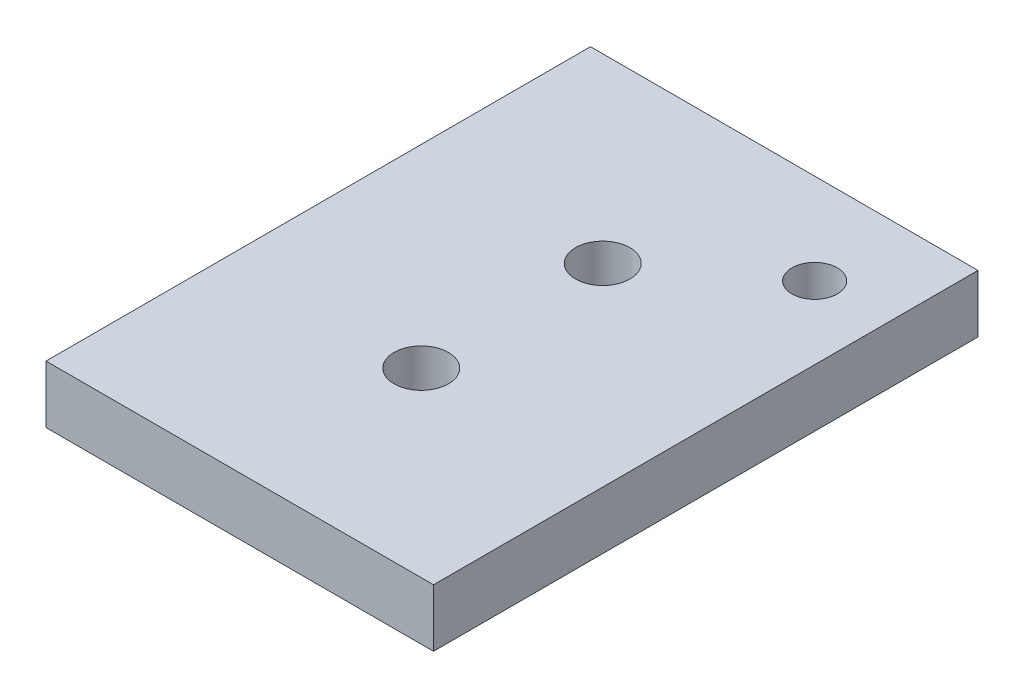
ISO-10303-21;
HEADER;
FILE_DESCRIPTION(('STEP AP214'),'2;1');
FILE_NAME('part.step','',(''),(''),'','','');
FILE_SCHEMA(('AUTOMOTIVE_DESIGN { 1 0 10303 214 1 1 1 1 }'));
ENDSEC;
DATA;
#1=APPLICATION_CONTEXT('core data for automotive mechanical design processes');
#2=APPLICATION_PROTOCOL_DEFINITION('international standard','automotive_design',2000,#1);
#3=PRODUCT_CONTEXT('',#1,'mechanical');
#4=PRODUCT('Part','Part','',(#3));
#5=PRODUCT_RELATED_PRODUCT_CATEGORY('part','',(#4));
#6=PRODUCT_DEFINITION_FORMATION('','',#4);
#7=PRODUCT_DEFINITION_CONTEXT('part definition',#1,'design');
#8=PRODUCT_DEFINITION('design','',#6,#7);
#9=PRODUCT_DEFINITION_SHAPE('','',#8);
#10=(LENGTH_UNIT() NAMED_UNIT(*) SI_UNIT(.MILLI.,.METRE.));
#11=(NAMED_UNIT(*) PLANE_ANGLE_UNIT() SI_UNIT($,.RADIAN.));
#12=(NAMED_UNIT(*) SI_UNIT($,.STERADIAN.) SOLID_ANGLE_UNIT());
#13=UNCERTAINTY_MEASURE_WITH_UNIT(LENGTH_MEASURE(1.E-05),#10,'distance_accuracy_value','');
#14=(GEOMETRIC_REPRESENTATION_CONTEXT(3) GLOBAL_UNCERTAINTY_ASSIGNED_CONTEXT((#13)) GLOBAL_UNIT_ASSIGNED_CONTEXT((#10,
#11,#12)) REPRESENTATION_CONTEXT('',''));
#15=CARTESIAN_POINT('',(0.,0.,0.));
#16=DIRECTION('',(0.,0.,1.));
#17=DIRECTION('',(1.,0.,0.));
#18=AXIS2_PLACEMENT_3D('',#15,#16,#17);
#19=CARTESIAN_POINT('',(0.,3.175,0.));
#20=DIRECTION('',(-1.,0.,0.));
#21=DIRECTION('',(0.,0.,1.));
#22=AXIS2_PLACEMENT_3D('',#19,#20,#21);
#23=PLANE('',#22);
#24=DIRECTION('',(0.,0.,-1.));
#25=VECTOR('',#24,1.);
#26=CARTESIAN_POINT('',(0.,0.,0.));
#27=LINE('',#26,#25);
#28=CARTESIAN_POINT('',(0.,0.,0.));
#29=VERTEX_POINT('',#28);
#30=CARTESIAN_POINT('',(0.,0.,-30.));
#31=VERTEX_POINT('',#30);
#32=EDGE_CURVE('E106',#29,#31,#27,.T.);
#33=ORIENTED_EDGE('',*,*,#32,.F.);
#34=DIRECTION('',(0.,-1.,0.));
#35=VECTOR('',#34,1.);
#36=CARTESIAN_POINT('',(0.,3.175,0.));
#37=LINE('',#36,#35);
#38=CARTESIAN_POINT('',(0.,3.175,0.));
#39=VERTEX_POINT('',#38);
#40=EDGE_CURVE('E11',#39,#29,#37,.T.);
#41=ORIENTED_EDGE('',*,*,#40,.F.);
#42=DIRECTION('',(0.,0.,-1.));
#43=VECTOR('',#42,1.);
#44=CARTESIAN_POINT('',(0.,3.175,0.));
#45=LINE('',#44,#43);
#46=CARTESIAN_POINT('',(0.,3.175,-30.));
#47=VERTEX_POINT('',#46);
#48=EDGE_CURVE('E90',#39,#47,#45,.T.);
#49=ORIENTED_EDGE('',*,*,#48,.T.);
#50=DIRECTION('',(0.,-1.,0.));
#51=VECTOR('',#50,1.);
#52=CARTESIAN_POINT('',(0.,3.175,-30.));
#53=LINE('',#52,#51);
#54=EDGE_CURVE('E52',#47,#31,#53,.T.);
#55=ORIENTED_EDGE('',*,*,#54,.T.);
#56=EDGE_LOOP('',(#33,#41,#49,#55));
#57=FACE_BOUND('',#56,.T.);
#58=ADVANCED_FACE('F35',(#57),#23,.T.);
#59=CARTESIAN_POINT('',(0.,3.175,0.));
#60=DIRECTION('',(0.,0.,-1.));
#61=DIRECTION('',(-1.,0.,0.));
#62=AXIS2_PLACEMENT_3D('',#59,#60,#61);
#63=PLANE('',#62);
#64=DIRECTION('',(1.,0.,0.));
#65=VECTOR('',#64,1.);
#66=CARTESIAN_POINT('',(0.,0.,0.));
#67=LINE('',#66,#65);
#68=CARTESIAN_POINT('',(21.35,0.,0.));
#69=VERTEX_POINT('',#68);
#70=EDGE_CURVE('E95',#29,#69,#67,.T.);
#71=ORIENTED_EDGE('',*,*,#70,.T.);
#72=DIRECTION('',(0.,-1.,0.));
#73=VECTOR('',#72,1.);
#74=CARTESIAN_POINT('',(21.35,3.175,0.));
#75=LINE('',#74,#73);
#76=CARTESIAN_POINT('',(21.35,3.175,0.));
#77=VERTEX_POINT('',#76);
#78=EDGE_CURVE('E44',#77,#69,#75,.T.);
#79=ORIENTED_EDGE('',*,*,#78,.F.);
#80=DIRECTION('',(1.,0.,0.));
#81=VECTOR('',#80,1.);
#82=CARTESIAN_POINT('',(0.,3.175,0.));
#83=LINE('',#82,#81);
#84=EDGE_CURVE('E86',#39,#77,#83,.T.);
#85=ORIENTED_EDGE('',*,*,#84,.F.);
#86=ORIENTED_EDGE('',*,*,#40,.T.);
#87=EDGE_LOOP('',(#71,#79,#85,#86));
#88=FACE_BOUND('',#87,.T.);
#89=ADVANCED_FACE('F93',(#88),#63,.F.);
#90=CARTESIAN_POINT('',(21.35,3.175,0.));
#91=DIRECTION('',(-1.,0.,0.));
#92=DIRECTION('',(0.,0.,1.));
#93=AXIS2_PLACEMENT_3D('',#90,#91,#92);
#94=PLANE('',#93);
#95=DIRECTION('',(0.,0.,-1.));
#96=VECTOR('',#95,1.);
#97=CARTESIAN_POINT('',(21.35,0.,0.));
#98=LINE('',#97,#96);
#99=CARTESIAN_POINT('',(21.35,0.,-30.));
#100=VERTEX_POINT('',#99);
#101=EDGE_CURVE('E103',#69,#100,#98,.T.);
#102=ORIENTED_EDGE('',*,*,#101,.T.);
#103=DIRECTION('',(0.,-1.,0.));
#104=VECTOR('',#103,1.);
#105=CARTESIAN_POINT('',(21.35,3.175,-30.));
#106=LINE('',#105,#104);
#107=CARTESIAN_POINT('',(21.35,3.175,-30.));
#108=VERTEX_POINT('',#107);
#109=EDGE_CURVE('E66',#108,#100,#106,.T.);
#110=ORIENTED_EDGE('',*,*,#109,.F.);
#111=DIRECTION('',(0.,0.,-1.));
#112=VECTOR('',#111,1.);
#113=CARTESIAN_POINT('',(21.35,3.175,0.));
#114=LINE('',#113,#112);
#115=EDGE_CURVE('E78',#77,#108,#114,.T.);
#116=ORIENTED_EDGE('',*,*,#115,.F.);
#117=ORIENTED_EDGE('',*,*,#78,.T.);
#118=EDGE_LOOP('',(#102,#110,#116,#117));
#119=FACE_BOUND('',#118,.T.);
#120=ADVANCED_FACE('F80',(#119),#94,.F.);
#121=CARTESIAN_POINT('',(17.35,3.175,-25.));
#122=DIRECTION('',(0.,-1.,0.));
#123=DIRECTION('',(0.,0.,-1.));
#124=AXIS2_PLACEMENT_3D('',#121,#122,#123);
#125=CYLINDRICAL_SURFACE('',#124,1.25000000000002);
#126=CARTESIAN_POINT('',(17.35,3.175,-25.));
#127=DIRECTION('',(0.,1.,0.));
#128=DIRECTION('',(0.,0.,1.));
#129=AXIS2_PLACEMENT_3D('',#126,#127,#128);
#130=CIRCLE('',#129,1.25000000000002);
#131=CARTESIAN_POINT('',(17.35,3.175,-23.75));
#132=VERTEX_POINT('',#131);
#133=EDGE_CURVE('E119',#132,#132,#130,.T.);
#134=ORIENTED_EDGE('',*,*,#133,.T.);
#135=EDGE_LOOP('',(#134));
#136=FACE_BOUND('',#135,.T.);
#137=CARTESIAN_POINT('',(17.35,0.,-25.));
#138=DIRECTION('',(0.,1.,0.));
#139=DIRECTION('',(0.,0.,1.));
#140=AXIS2_PLACEMENT_3D('',#137,#138,#139);
#141=CIRCLE('',#140,1.25000000000002);
#142=CARTESIAN_POINT('',(17.35,0.,-23.75));
#143=VERTEX_POINT('',#142);
#144=EDGE_CURVE('E108',#143,#143,#141,.T.);
#145=ORIENTED_EDGE('',*,*,#144,.F.);
#146=EDGE_LOOP('',(#145));
#147=FACE_BOUND('',#146,.T.);
#148=ADVANCED_FACE('F139',(#136,#147),#125,.F.);
#149=CARTESIAN_POINT('',(10.675,3.175,-10.));
#150=DIRECTION('',(0.,-1.,0.));
#151=DIRECTION('',(0.,0.,-1.));
#152=AXIS2_PLACEMENT_3D('',#149,#150,#151);
#153=CYLINDRICAL_SURFACE('',#152,1.5);
#154=CARTESIAN_POINT('',(10.675,3.175,-10.));
#155=DIRECTION('',(0.,1.,0.));
#156=DIRECTION('',(0.,0.,1.));
#157=AXIS2_PLACEMENT_3D('',#154,#155,#156);
#158=CIRCLE('',#157,1.5);
#159=CARTESIAN_POINT('',(10.675,3.175,-8.5));
#160=VERTEX_POINT('',#159);
#161=EDGE_CURVE('E122',#160,#160,#158,.T.);
#162=ORIENTED_EDGE('',*,*,#161,.T.);
#163=EDGE_LOOP('',(#162));
#164=FACE_BOUND('',#163,.T.);
#165=CARTESIAN_POINT('',(10.675,0.,-10.));
#166=DIRECTION('',(0.,1.,0.));
#167=DIRECTION('',(0.,0.,1.));
#168=AXIS2_PLACEMENT_3D('',#165,#166,#167);
#169=CIRCLE('',#168,1.5);
#170=CARTESIAN_POINT('',(10.675,0.,-8.5));
#171=VERTEX_POINT('',#170);
#172=EDGE_CURVE('E111',#171,#171,#169,.T.);
#173=ORIENTED_EDGE('',*,*,#172,.F.);
#174=EDGE_LOOP('',(#173));
#175=FACE_BOUND('',#174,.T.);
#176=ADVANCED_FACE('F142',(#164,#175),#153,.F.);
#177=CARTESIAN_POINT('',(10.675,3.175,-20.));
#178=DIRECTION('',(0.,-1.,0.));
#179=DIRECTION('',(0.,0.,-1.));
#180=AXIS2_PLACEMENT_3D('',#177,#178,#179);
#181=CYLINDRICAL_SURFACE('',#180,1.5);
#182=CARTESIAN_POINT('',(10.675,3.175,-20.));
#183=DIRECTION('',(0.,1.,0.));
#184=DIRECTION('',(0.,0.,1.));
#185=AXIS2_PLACEMENT_3D('',#182,#183,#184);
#186=CIRCLE('',#185,1.5);
#187=CARTESIAN_POINT('',(10.675,3.175,-18.5));
#188=VERTEX_POINT('',#187);
#189=EDGE_CURVE('E102',#188,#188,#186,.T.);
#190=ORIENTED_EDGE('',*,*,#189,.T.);
#191=EDGE_LOOP('',(#190));
#192=FACE_BOUND('',#191,.T.);
#193=CARTESIAN_POINT('',(10.675,0.,-20.));
#194=DIRECTION('',(0.,1.,0.));
#195=DIRECTION('',(0.,0.,1.));
#196=AXIS2_PLACEMENT_3D('',#193,#194,#195);
#197=CIRCLE('',#196,1.5);
#198=CARTESIAN_POINT('',(10.675,0.,-18.5));
#199=VERTEX_POINT('',#198);
#200=EDGE_CURVE('E114',#199,#199,#197,.T.);
#201=ORIENTED_EDGE('',*,*,#200,.F.);
#202=EDGE_LOOP('',(#201));
#203=FACE_BOUND('',#202,.T.);
#204=ADVANCED_FACE('F37',(#192,#203),#181,.F.);
#205=CARTESIAN_POINT('',(0.,3.175,-30.));
#206=DIRECTION('',(0.,0.,-1.));
#207=DIRECTION('',(-1.,0.,0.));
#208=AXIS2_PLACEMENT_3D('',#205,#206,#207);
#209=PLANE('',#208);
#210=DIRECTION('',(1.,0.,0.));
#211=VECTOR('',#210,1.);
#212=CARTESIAN_POINT('',(0.,0.,-30.));
#213=LINE('',#212,#211);
#214=EDGE_CURVE('E99',#31,#100,#213,.T.);
#215=ORIENTED_EDGE('',*,*,#214,.F.);
#216=ORIENTED_EDGE('',*,*,#54,.F.);
#217=DIRECTION('',(1.,0.,0.));
#218=VECTOR('',#217,1.);
#219=CARTESIAN_POINT('',(0.,3.175,-30.));
#220=LINE('',#219,#218);
#221=EDGE_CURVE('E85',#47,#108,#220,.T.);
#222=ORIENTED_EDGE('',*,*,#221,.T.);
#223=ORIENTED_EDGE('',*,*,#109,.T.);
#224=EDGE_LOOP('',(#215,#216,#222,#223));
#225=FACE_BOUND('',#224,.T.);
#226=ADVANCED_FACE('F133',(#225),#209,.T.);
#227=CARTESIAN_POINT('',(0.,3.175,0.));
#228=DIRECTION('',(0.,1.,0.));
#229=DIRECTION('',(0.,0.,1.));
#230=AXIS2_PLACEMENT_3D('',#227,#228,#229);
#231=PLANE('',#230);
#232=ORIENTED_EDGE('',*,*,#189,.F.);
#233=EDGE_LOOP('',(#232));
#234=FACE_BOUND('',#233,.T.);
#235=ORIENTED_EDGE('',*,*,#161,.F.);
#236=EDGE_LOOP('',(#235));
#237=FACE_BOUND('',#236,.T.);
#238=ORIENTED_EDGE('',*,*,#133,.F.);
#239=EDGE_LOOP('',(#238));
#240=FACE_BOUND('',#239,.T.);
#241=ORIENTED_EDGE('',*,*,#48,.F.);
#242=ORIENTED_EDGE('',*,*,#84,.T.);
#243=ORIENTED_EDGE('',*,*,#115,.T.);
#244=ORIENTED_EDGE('',*,*,#221,.F.);
#245=EDGE_LOOP('',(#241,#242,#243,#244));
#246=FACE_BOUND('',#245,.T.);
#247=ADVANCED_FACE('F89',(#234,#237,#240,#246),#231,.T.);
#248=CARTESIAN_POINT('',(0.,0.,0.));
#249=DIRECTION('',(0.,1.,0.));
#250=DIRECTION('',(0.,0.,1.));
#251=AXIS2_PLACEMENT_3D('',#248,#249,#250);
#252=PLANE('',#251);
#253=ORIENTED_EDGE('',*,*,#200,.T.);
#254=EDGE_LOOP('',(#253));
#255=FACE_BOUND('',#254,.T.);
#256=ORIENTED_EDGE('',*,*,#172,.T.);
#257=EDGE_LOOP('',(#256));
#258=FACE_BOUND('',#257,.T.);
#259=ORIENTED_EDGE('',*,*,#144,.T.);
#260=EDGE_LOOP('',(#259));
#261=FACE_BOUND('',#260,.T.);
#262=ORIENTED_EDGE('',*,*,#32,.T.);
#263=ORIENTED_EDGE('',*,*,#214,.T.);
#264=ORIENTED_EDGE('',*,*,#101,.F.);
#265=ORIENTED_EDGE('',*,*,#70,.F.);
#266=EDGE_LOOP('',(#262,#263,#264,#265));
#267=FACE_BOUND('',#266,.T.);
#268=ADVANCED_FACE('F132',(#255,#258,#261,#267),#252,.F.);
#269=CLOSED_SHELL('',(#58,#89,#120,#148,#176,#204,#226,#247,#268));
#270=MANIFOLD_SOLID_BREP('B2',#269);
#271=ADVANCED_BREP_SHAPE_REPRESENTATION('',(#18,#270),#14);
#272=SHAPE_DEFINITION_REPRESENTATION(#9,#271);
ENDSEC;
END-ISO-10303-21;
